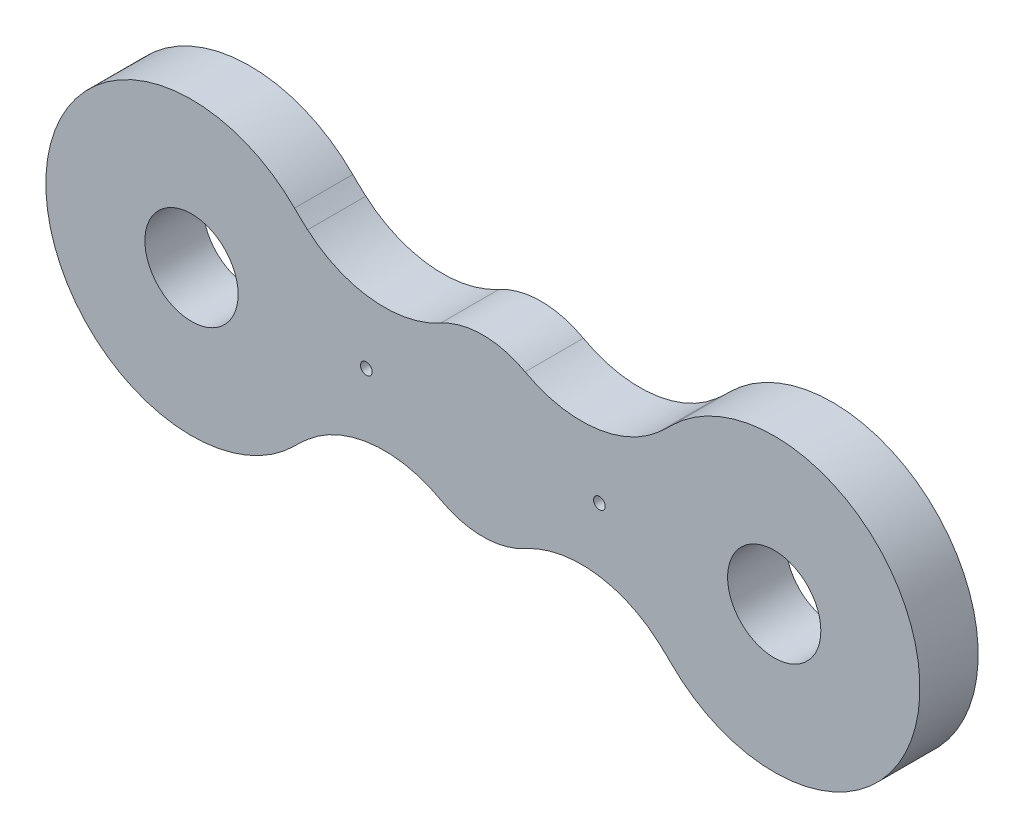
ISO-10303-21;
HEADER;
FILE_DESCRIPTION(('STEP AP214'),'2;1');
FILE_NAME('part.step','',(''),(''),'','','');
FILE_SCHEMA(('AUTOMOTIVE_DESIGN { 1 0 10303 214 1 1 1 1 }'));
ENDSEC;
DATA;
#1=APPLICATION_CONTEXT('core data for automotive mechanical design processes');
#2=APPLICATION_PROTOCOL_DEFINITION('international standard','automotive_design',2000,#1);
#3=PRODUCT_CONTEXT('',#1,'mechanical');
#4=PRODUCT('Part','Part','',(#3));
#5=PRODUCT_RELATED_PRODUCT_CATEGORY('part','',(#4));
#6=PRODUCT_DEFINITION_FORMATION('','',#4);
#7=PRODUCT_DEFINITION_CONTEXT('part definition',#1,'design');
#8=PRODUCT_DEFINITION('design','',#6,#7);
#9=PRODUCT_DEFINITION_SHAPE('','',#8);
#10=(LENGTH_UNIT() NAMED_UNIT(*) SI_UNIT(.MILLI.,.METRE.));
#11=(NAMED_UNIT(*) PLANE_ANGLE_UNIT() SI_UNIT($,.RADIAN.));
#12=(NAMED_UNIT(*) SI_UNIT($,.STERADIAN.) SOLID_ANGLE_UNIT());
#13=UNCERTAINTY_MEASURE_WITH_UNIT(LENGTH_MEASURE(1.E-05),#10,'distance_accuracy_value','');
#14=(GEOMETRIC_REPRESENTATION_CONTEXT(3) GLOBAL_UNCERTAINTY_ASSIGNED_CONTEXT((#13)) GLOBAL_UNIT_ASSIGNED_CONTEXT((#10,
#11,#12)) REPRESENTATION_CONTEXT('',''));
#15=CARTESIAN_POINT('',(0.,0.,0.));
#16=DIRECTION('',(0.,0.,1.));
#17=DIRECTION('',(1.,0.,0.));
#18=AXIS2_PLACEMENT_3D('',#15,#16,#17);
#19=CARTESIAN_POINT('',(-4.22946716685515,20.1599025766974,5.));
#20=DIRECTION('',(0.,0.,1.));
#21=DIRECTION('',(1.,0.,0.));
#22=AXIS2_PLACEMENT_3D('',#19,#20,#21);
#23=PLANE('',#22);
#24=CARTESIAN_POINT('',(-10.,0.,5.));
#25=DIRECTION('',(0.,0.,1.));
#26=DIRECTION('',(1.,0.,0.));
#27=AXIS2_PLACEMENT_3D('',#24,#25,#26);
#28=CIRCLE('',#27,0.500000000000001);
#29=CARTESIAN_POINT('',(-9.5,0.,5.));
#30=VERTEX_POINT('',#29);
#31=EDGE_CURVE('E291',#30,#30,#28,.T.);
#32=ORIENTED_EDGE('',*,*,#31,.F.);
#33=EDGE_LOOP('',(#32));
#34=FACE_BOUND('',#33,.T.);
#35=CARTESIAN_POINT('',(-25.,0.,5.));
#36=DIRECTION('',(0.,0.,1.));
#37=DIRECTION('',(1.,0.,0.));
#38=AXIS2_PLACEMENT_3D('',#35,#36,#37);
#39=CIRCLE('',#38,4.);
#40=CARTESIAN_POINT('',(-21.,0.,5.));
#41=VERTEX_POINT('',#40);
#42=EDGE_CURVE('E157',#41,#41,#39,.T.);
#43=ORIENTED_EDGE('',*,*,#42,.F.);
#44=EDGE_LOOP('',(#43));
#45=FACE_BOUND('',#44,.T.);
#46=CARTESIAN_POINT('',(0.,25.0000000000001,5.));
#47=DIRECTION('',(0.,0.,-1.));
#48=DIRECTION('',(1.,0.,0.));
#49=AXIS2_PLACEMENT_3D('',#46,#47,#48);
#50=CIRCLE('',#49,22.8553390593274);
#51=CARTESIAN_POINT('',(-15.0390286390198,7.78970827930107,5.));
#52=VERTEX_POINT('',#51);
#53=CARTESIAN_POINT('',(-16.1611652351682,8.83883476483186,5.));
#54=VERTEX_POINT('',#53);
#55=EDGE_CURVE('E176',#52,#54,#50,.T.);
#56=ORIENTED_EDGE('',*,*,#55,.T.);
#57=CARTESIAN_POINT('',(-25.,0.,5.));
#58=DIRECTION('',(0.,0.,1.));
#59=DIRECTION('',(1.,0.,0.));
#60=AXIS2_PLACEMENT_3D('',#57,#58,#59);
#61=CIRCLE('',#60,12.5);
#62=CARTESIAN_POINT('',(-16.1611652351681,-8.83883476483179,5.));
#63=VERTEX_POINT('',#62);
#64=EDGE_CURVE('E104',#54,#63,#61,.T.);
#65=ORIENTED_EDGE('',*,*,#64,.T.);
#66=CARTESIAN_POINT('',(0.,-24.9999999999997,5.));
#67=DIRECTION('',(0.,0.,-1.));
#68=DIRECTION('',(-1.,0.,0.));
#69=AXIS2_PLACEMENT_3D('',#66,#67,#68);
#70=CIRCLE('',#69,22.8553390593272);
#71=CARTESIAN_POINT('',(-15.03902863902,-7.7897082793012,5.));
#72=VERTEX_POINT('',#71);
#73=EDGE_CURVE('E203',#63,#72,#70,.T.);
#74=ORIENTED_EDGE('',*,*,#73,.T.);
#75=CARTESIAN_POINT('',(-8.45893433371032,-15.3198051533946,5.));
#76=DIRECTION('',(0.,0.,-1.));
#77=DIRECTION('',(1.,0.,0.));
#78=AXIS2_PLACEMENT_3D('',#75,#76,#77);
#79=CIRCLE('',#78,10.);
#80=CARTESIAN_POINT('',(-3.62525757159014,-6.56563078002627,5.));
#81=VERTEX_POINT('',#80);
#82=EDGE_CURVE('E222',#72,#81,#79,.T.);
#83=ORIENTED_EDGE('',*,*,#82,.T.);
#84=CARTESIAN_POINT('',(0.,0.,5.));
#85=DIRECTION('',(0.,0.,1.));
#86=DIRECTION('',(1.,0.,0.));
#87=AXIS2_PLACEMENT_3D('',#84,#85,#86);
#88=CIRCLE('',#87,7.5);
#89=CARTESIAN_POINT('',(3.62525757159014,-6.56563078002627,5.));
#90=VERTEX_POINT('',#89);
#91=EDGE_CURVE('E219',#81,#90,#88,.T.);
#92=ORIENTED_EDGE('',*,*,#91,.T.);
#93=CARTESIAN_POINT('',(8.45893433371032,-15.3198051533946,5.));
#94=DIRECTION('',(0.,0.,-1.));
#95=DIRECTION('',(-1.,0.,0.));
#96=AXIS2_PLACEMENT_3D('',#93,#94,#95);
#97=CIRCLE('',#96,10.);
#98=CARTESIAN_POINT('',(15.03902863902,-7.78970827930119,5.));
#99=VERTEX_POINT('',#98);
#100=EDGE_CURVE('E221',#90,#99,#97,.T.);
#101=ORIENTED_EDGE('',*,*,#100,.T.);
#102=CARTESIAN_POINT('',(0.,-24.9999999999997,5.));
#103=DIRECTION('',(0.,0.,-1.));
#104=DIRECTION('',(-1.,0.,0.));
#105=AXIS2_PLACEMENT_3D('',#102,#103,#104);
#106=CIRCLE('',#105,22.8553390593272);
#107=CARTESIAN_POINT('',(16.1611652351682,-8.83883476483186,5.));
#108=VERTEX_POINT('',#107);
#109=EDGE_CURVE('E224',#99,#108,#106,.T.);
#110=ORIENTED_EDGE('',*,*,#109,.T.);
#111=CARTESIAN_POINT('',(25.,0.,5.));
#112=DIRECTION('',(0.,0.,1.));
#113=DIRECTION('',(1.,0.,0.));
#114=AXIS2_PLACEMENT_3D('',#111,#112,#113);
#115=CIRCLE('',#114,12.5);
#116=CARTESIAN_POINT('',(16.1611652351681,8.83883476483179,5.));
#117=VERTEX_POINT('',#116);
#118=EDGE_CURVE('E230',#108,#117,#115,.T.);
#119=ORIENTED_EDGE('',*,*,#118,.T.);
#120=CARTESIAN_POINT('',(0.,25.0000000000001,5.));
#121=DIRECTION('',(0.,0.,-1.));
#122=DIRECTION('',(1.,0.,0.));
#123=AXIS2_PLACEMENT_3D('',#120,#121,#122);
#124=CIRCLE('',#123,22.8553390593274);
#125=CARTESIAN_POINT('',(15.0390286390198,7.78970827930105,5.));
#126=VERTEX_POINT('',#125);
#127=EDGE_CURVE('E135',#117,#126,#124,.T.);
#128=ORIENTED_EDGE('',*,*,#127,.T.);
#129=CARTESIAN_POINT('',(8.4589343337103,15.3198051533946,5.));
#130=DIRECTION('',(0.,0.,-1.));
#131=DIRECTION('',(1.,0.,0.));
#132=AXIS2_PLACEMENT_3D('',#129,#130,#131);
#133=CIRCLE('',#132,10.);
#134=CARTESIAN_POINT('',(3.62525757159012,6.56563078002627,5.));
#135=VERTEX_POINT('',#134);
#136=EDGE_CURVE('E129',#126,#135,#133,.T.);
#137=ORIENTED_EDGE('',*,*,#136,.T.);
#138=CARTESIAN_POINT('',(0.,0.,5.));
#139=DIRECTION('',(0.,0.,1.));
#140=DIRECTION('',(1.,0.,0.));
#141=AXIS2_PLACEMENT_3D('',#138,#139,#140);
#142=CIRCLE('',#141,7.49999999999999);
#143=CARTESIAN_POINT('',(-3.62525757159013,6.56563078002627,5.));
#144=VERTEX_POINT('',#143);
#145=EDGE_CURVE('E133',#135,#144,#142,.T.);
#146=ORIENTED_EDGE('',*,*,#145,.T.);
#147=CARTESIAN_POINT('',(-8.4589343337103,15.3198051533946,5.));
#148=DIRECTION('',(0.,0.,-1.));
#149=DIRECTION('',(1.,0.,0.));
#150=AXIS2_PLACEMENT_3D('',#147,#148,#149);
#151=CIRCLE('',#150,10.);
#152=EDGE_CURVE('E49',#144,#52,#151,.T.);
#153=ORIENTED_EDGE('',*,*,#152,.T.);
#154=EDGE_LOOP('',(#56,#65,#74,#83,#92,#101,#110,#119,#128,#137,#146,#153));
#155=FACE_BOUND('',#154,.T.);
#156=CARTESIAN_POINT('',(25.,0.,5.));
#157=DIRECTION('',(0.,0.,1.));
#158=DIRECTION('',(1.,0.,0.));
#159=AXIS2_PLACEMENT_3D('',#156,#157,#158);
#160=CIRCLE('',#159,4.);
#161=CARTESIAN_POINT('',(29.,0.,5.));
#162=VERTEX_POINT('',#161);
#163=EDGE_CURVE('E297',#162,#162,#160,.T.);
#164=ORIENTED_EDGE('',*,*,#163,.F.);
#165=EDGE_LOOP('',(#164));
#166=FACE_BOUND('',#165,.T.);
#167=CARTESIAN_POINT('',(10.,0.,5.));
#168=DIRECTION('',(0.,0.,1.));
#169=DIRECTION('',(1.,0.,0.));
#170=AXIS2_PLACEMENT_3D('',#167,#168,#169);
#171=CIRCLE('',#170,0.500000000000001);
#172=CARTESIAN_POINT('',(10.5,0.,5.));
#173=VERTEX_POINT('',#172);
#174=EDGE_CURVE('E282',#173,#173,#171,.T.);
#175=ORIENTED_EDGE('',*,*,#174,.F.);
#176=EDGE_LOOP('',(#175));
#177=FACE_BOUND('',#176,.T.);
#178=ADVANCED_FACE('F32',(#34,#45,#155,#166,#177),#23,.T.);
#179=CARTESIAN_POINT('',(-4.22946716685515,20.1599025766974,0.));
#180=DIRECTION('',(0.,0.,1.));
#181=DIRECTION('',(1.,0.,0.));
#182=AXIS2_PLACEMENT_3D('',#179,#180,#181);
#183=PLANE('',#182);
#184=CARTESIAN_POINT('',(-10.,0.,0.));
#185=DIRECTION('',(0.,0.,1.));
#186=DIRECTION('',(1.,0.,0.));
#187=AXIS2_PLACEMENT_3D('',#184,#185,#186);
#188=CIRCLE('',#187,0.500000000000001);
#189=CARTESIAN_POINT('',(-9.5,0.,0.));
#190=VERTEX_POINT('',#189);
#191=EDGE_CURVE('E288',#190,#190,#188,.T.);
#192=ORIENTED_EDGE('',*,*,#191,.T.);
#193=EDGE_LOOP('',(#192));
#194=FACE_BOUND('',#193,.T.);
#195=CARTESIAN_POINT('',(-25.,0.,0.));
#196=DIRECTION('',(0.,0.,1.));
#197=DIRECTION('',(1.,0.,0.));
#198=AXIS2_PLACEMENT_3D('',#195,#196,#197);
#199=CIRCLE('',#198,4.);
#200=CARTESIAN_POINT('',(-21.,0.,0.));
#201=VERTEX_POINT('',#200);
#202=EDGE_CURVE('E300',#201,#201,#199,.T.);
#203=ORIENTED_EDGE('',*,*,#202,.T.);
#204=EDGE_LOOP('',(#203));
#205=FACE_BOUND('',#204,.T.);
#206=CARTESIAN_POINT('',(0.,25.0000000000001,0.));
#207=DIRECTION('',(0.,0.,-1.));
#208=DIRECTION('',(1.,0.,0.));
#209=AXIS2_PLACEMENT_3D('',#206,#207,#208);
#210=CIRCLE('',#209,22.8553390593274);
#211=CARTESIAN_POINT('',(-15.0390286390198,7.78970827930107,0.));
#212=VERTEX_POINT('',#211);
#213=CARTESIAN_POINT('',(-16.1611652351682,8.83883476483186,0.));
#214=VERTEX_POINT('',#213);
#215=EDGE_CURVE('E153',#212,#214,#210,.T.);
#216=ORIENTED_EDGE('',*,*,#215,.F.);
#217=CARTESIAN_POINT('',(-8.4589343337103,15.3198051533946,0.));
#218=DIRECTION('',(0.,0.,-1.));
#219=DIRECTION('',(1.,0.,0.));
#220=AXIS2_PLACEMENT_3D('',#217,#218,#219);
#221=CIRCLE('',#220,10.);
#222=CARTESIAN_POINT('',(-3.62525757159013,6.56563078002627,0.));
#223=VERTEX_POINT('',#222);
#224=EDGE_CURVE('E96',#223,#212,#221,.T.);
#225=ORIENTED_EDGE('',*,*,#224,.F.);
#226=CARTESIAN_POINT('',(0.,0.,0.));
#227=DIRECTION('',(0.,0.,1.));
#228=DIRECTION('',(1.,0.,0.));
#229=AXIS2_PLACEMENT_3D('',#226,#227,#228);
#230=CIRCLE('',#229,7.49999999999999);
#231=CARTESIAN_POINT('',(3.62525757159012,6.56563078002627,0.));
#232=VERTEX_POINT('',#231);
#233=EDGE_CURVE('E90',#232,#223,#230,.T.);
#234=ORIENTED_EDGE('',*,*,#233,.F.);
#235=CARTESIAN_POINT('',(8.4589343337103,15.3198051533946,0.));
#236=DIRECTION('',(0.,0.,-1.));
#237=DIRECTION('',(1.,0.,0.));
#238=AXIS2_PLACEMENT_3D('',#235,#236,#237);
#239=CIRCLE('',#238,10.);
#240=CARTESIAN_POINT('',(15.0390286390198,7.78970827930105,0.));
#241=VERTEX_POINT('',#240);
#242=EDGE_CURVE('E143',#241,#232,#239,.T.);
#243=ORIENTED_EDGE('',*,*,#242,.F.);
#244=CARTESIAN_POINT('',(0.,25.0000000000001,0.));
#245=DIRECTION('',(0.,0.,-1.));
#246=DIRECTION('',(1.,0.,0.));
#247=AXIS2_PLACEMENT_3D('',#244,#245,#246);
#248=CIRCLE('',#247,22.8553390593274);
#249=CARTESIAN_POINT('',(16.1611652351681,8.83883476483179,0.));
#250=VERTEX_POINT('',#249);
#251=EDGE_CURVE('E171',#250,#241,#248,.T.);
#252=ORIENTED_EDGE('',*,*,#251,.F.);
#253=CARTESIAN_POINT('',(25.,0.,0.));
#254=DIRECTION('',(0.,0.,1.));
#255=DIRECTION('',(1.,0.,0.));
#256=AXIS2_PLACEMENT_3D('',#253,#254,#255);
#257=CIRCLE('',#256,12.5);
#258=CARTESIAN_POINT('',(16.1611652351682,-8.83883476483186,0.));
#259=VERTEX_POINT('',#258);
#260=EDGE_CURVE('E169',#259,#250,#257,.T.);
#261=ORIENTED_EDGE('',*,*,#260,.F.);
#262=CARTESIAN_POINT('',(0.,-24.9999999999997,0.));
#263=DIRECTION('',(0.,0.,-1.));
#264=DIRECTION('',(-1.,0.,0.));
#265=AXIS2_PLACEMENT_3D('',#262,#263,#264);
#266=CIRCLE('',#265,22.8553390593272);
#267=CARTESIAN_POINT('',(15.03902863902,-7.78970827930119,0.));
#268=VERTEX_POINT('',#267);
#269=EDGE_CURVE('E167',#268,#259,#266,.T.);
#270=ORIENTED_EDGE('',*,*,#269,.F.);
#271=CARTESIAN_POINT('',(8.45893433371032,-15.3198051533946,0.));
#272=DIRECTION('',(0.,0.,-1.));
#273=DIRECTION('',(-1.,0.,0.));
#274=AXIS2_PLACEMENT_3D('',#271,#272,#273);
#275=CIRCLE('',#274,10.);
#276=CARTESIAN_POINT('',(3.62525757159014,-6.56563078002627,0.));
#277=VERTEX_POINT('',#276);
#278=EDGE_CURVE('E165',#277,#268,#275,.T.);
#279=ORIENTED_EDGE('',*,*,#278,.F.);
#280=CARTESIAN_POINT('',(0.,0.,0.));
#281=DIRECTION('',(0.,0.,1.));
#282=DIRECTION('',(1.,0.,0.));
#283=AXIS2_PLACEMENT_3D('',#280,#281,#282);
#284=CIRCLE('',#283,7.5);
#285=CARTESIAN_POINT('',(-3.62525757159014,-6.56563078002627,0.));
#286=VERTEX_POINT('',#285);
#287=EDGE_CURVE('E163',#286,#277,#284,.T.);
#288=ORIENTED_EDGE('',*,*,#287,.F.);
#289=CARTESIAN_POINT('',(-8.45893433371032,-15.3198051533946,0.));
#290=DIRECTION('',(0.,0.,-1.));
#291=DIRECTION('',(1.,0.,0.));
#292=AXIS2_PLACEMENT_3D('',#289,#290,#291);
#293=CIRCLE('',#292,10.);
#294=CARTESIAN_POINT('',(-15.03902863902,-7.7897082793012,0.));
#295=VERTEX_POINT('',#294);
#296=EDGE_CURVE('E161',#295,#286,#293,.T.);
#297=ORIENTED_EDGE('',*,*,#296,.F.);
#298=CARTESIAN_POINT('',(0.,-24.9999999999997,0.));
#299=DIRECTION('',(0.,0.,-1.));
#300=DIRECTION('',(-1.,0.,0.));
#301=AXIS2_PLACEMENT_3D('',#298,#299,#300);
#302=CIRCLE('',#301,22.8553390593272);
#303=CARTESIAN_POINT('',(-16.1611652351681,-8.83883476483179,0.));
#304=VERTEX_POINT('',#303);
#305=EDGE_CURVE('E159',#304,#295,#302,.T.);
#306=ORIENTED_EDGE('',*,*,#305,.F.);
#307=CARTESIAN_POINT('',(-25.,0.,0.));
#308=DIRECTION('',(0.,0.,1.));
#309=DIRECTION('',(1.,0.,0.));
#310=AXIS2_PLACEMENT_3D('',#307,#308,#309);
#311=CIRCLE('',#310,12.5);
#312=EDGE_CURVE('E156',#214,#304,#311,.T.);
#313=ORIENTED_EDGE('',*,*,#312,.F.);
#314=EDGE_LOOP('',(#216,#225,#234,#243,#252,#261,#270,#279,#288,#297,#306,#313));
#315=FACE_BOUND('',#314,.T.);
#316=CARTESIAN_POINT('',(25.,0.,0.));
#317=DIRECTION('',(0.,0.,1.));
#318=DIRECTION('',(1.,0.,0.));
#319=AXIS2_PLACEMENT_3D('',#316,#317,#318);
#320=CIRCLE('',#319,4.);
#321=CARTESIAN_POINT('',(29.,0.,0.));
#322=VERTEX_POINT('',#321);
#323=EDGE_CURVE('E294',#322,#322,#320,.T.);
#324=ORIENTED_EDGE('',*,*,#323,.T.);
#325=EDGE_LOOP('',(#324));
#326=FACE_BOUND('',#325,.T.);
#327=CARTESIAN_POINT('',(10.,0.,0.));
#328=DIRECTION('',(0.,0.,1.));
#329=DIRECTION('',(1.,0.,0.));
#330=AXIS2_PLACEMENT_3D('',#327,#328,#329);
#331=CIRCLE('',#330,0.500000000000001);
#332=CARTESIAN_POINT('',(10.5,0.,0.));
#333=VERTEX_POINT('',#332);
#334=EDGE_CURVE('E285',#333,#333,#331,.T.);
#335=ORIENTED_EDGE('',*,*,#334,.T.);
#336=EDGE_LOOP('',(#335));
#337=FACE_BOUND('',#336,.T.);
#338=ADVANCED_FACE('F207',(#194,#205,#315,#326,#337),#183,.F.);
#339=CARTESIAN_POINT('',(0.,25.0000000000001,5.));
#340=DIRECTION('',(0.,0.,-1.));
#341=DIRECTION('',(-1.,0.,0.));
#342=AXIS2_PLACEMENT_3D('',#339,#340,#341);
#343=CYLINDRICAL_SURFACE('',#342,22.8553390593274);
#344=ORIENTED_EDGE('',*,*,#215,.T.);
#345=DIRECTION('',(0.,0.,-1.));
#346=VECTOR('',#345,1.);
#347=CARTESIAN_POINT('',(-16.1611652351682,8.83883476483186,5.));
#348=LINE('',#347,#346);
#349=EDGE_CURVE('E11',#54,#214,#348,.T.);
#350=ORIENTED_EDGE('',*,*,#349,.F.);
#351=ORIENTED_EDGE('',*,*,#55,.F.);
#352=DIRECTION('',(0.,0.,-1.));
#353=VECTOR('',#352,1.);
#354=CARTESIAN_POINT('',(-15.0390286390198,7.78970827930107,5.));
#355=LINE('',#354,#353);
#356=EDGE_CURVE('E149',#52,#212,#355,.T.);
#357=ORIENTED_EDGE('',*,*,#356,.T.);
#358=EDGE_LOOP('',(#344,#350,#351,#357));
#359=FACE_BOUND('',#358,.T.);
#360=ADVANCED_FACE('F34',(#359),#343,.F.);
#361=CARTESIAN_POINT('',(-25.,0.,5.));
#362=DIRECTION('',(0.,0.,-1.));
#363=DIRECTION('',(-1.,0.,0.));
#364=AXIS2_PLACEMENT_3D('',#361,#362,#363);
#365=CYLINDRICAL_SURFACE('',#364,12.5);
#366=ORIENTED_EDGE('',*,*,#312,.T.);
#367=DIRECTION('',(0.,0.,-1.));
#368=VECTOR('',#367,1.);
#369=CARTESIAN_POINT('',(-16.1611652351681,-8.83883476483179,5.));
#370=LINE('',#369,#368);
#371=EDGE_CURVE('E41',#63,#304,#370,.T.);
#372=ORIENTED_EDGE('',*,*,#371,.F.);
#373=ORIENTED_EDGE('',*,*,#64,.F.);
#374=ORIENTED_EDGE('',*,*,#349,.T.);
#375=EDGE_LOOP('',(#366,#372,#373,#374));
#376=FACE_BOUND('',#375,.T.);
#377=ADVANCED_FACE('F409',(#376),#365,.T.);
#378=CARTESIAN_POINT('',(0.,-24.9999999999997,5.));
#379=DIRECTION('',(0.,0.,-1.));
#380=DIRECTION('',(-1.,0.,0.));
#381=AXIS2_PLACEMENT_3D('',#378,#379,#380);
#382=CYLINDRICAL_SURFACE('',#381,22.8553390593272);
#383=ORIENTED_EDGE('',*,*,#305,.T.);
#384=DIRECTION('',(0.,0.,-1.));
#385=VECTOR('',#384,1.);
#386=CARTESIAN_POINT('',(-15.03902863902,-7.7897082793012,5.));
#387=LINE('',#386,#385);
#388=EDGE_CURVE('E195',#72,#295,#387,.T.);
#389=ORIENTED_EDGE('',*,*,#388,.F.);
#390=ORIENTED_EDGE('',*,*,#73,.F.);
#391=ORIENTED_EDGE('',*,*,#371,.T.);
#392=EDGE_LOOP('',(#383,#389,#390,#391));
#393=FACE_BOUND('',#392,.T.);
#394=ADVANCED_FACE('F201',(#393),#382,.F.);
#395=CARTESIAN_POINT('',(-8.45893433371032,-15.3198051533946,5.));
#396=DIRECTION('',(0.,0.,-1.));
#397=DIRECTION('',(-1.,0.,0.));
#398=AXIS2_PLACEMENT_3D('',#395,#396,#397);
#399=CYLINDRICAL_SURFACE('',#398,10.);
#400=ORIENTED_EDGE('',*,*,#296,.T.);
#401=DIRECTION('',(0.,0.,-1.));
#402=VECTOR('',#401,1.);
#403=CARTESIAN_POINT('',(-3.62525757159014,-6.56563078002627,5.));
#404=LINE('',#403,#402);
#405=EDGE_CURVE('E192',#81,#286,#404,.T.);
#406=ORIENTED_EDGE('',*,*,#405,.F.);
#407=ORIENTED_EDGE('',*,*,#82,.F.);
#408=ORIENTED_EDGE('',*,*,#388,.T.);
#409=EDGE_LOOP('',(#400,#406,#407,#408));
#410=FACE_BOUND('',#409,.T.);
#411=ADVANCED_FACE('F213',(#410),#399,.F.);
#412=CARTESIAN_POINT('',(0.,0.,5.));
#413=DIRECTION('',(0.,0.,-1.));
#414=DIRECTION('',(-1.,0.,0.));
#415=AXIS2_PLACEMENT_3D('',#412,#413,#414);
#416=CYLINDRICAL_SURFACE('',#415,7.5);
#417=ORIENTED_EDGE('',*,*,#287,.T.);
#418=DIRECTION('',(0.,0.,-1.));
#419=VECTOR('',#418,1.);
#420=CARTESIAN_POINT('',(3.62525757159014,-6.56563078002627,5.));
#421=LINE('',#420,#419);
#422=EDGE_CURVE('E189',#90,#277,#421,.T.);
#423=ORIENTED_EDGE('',*,*,#422,.F.);
#424=ORIENTED_EDGE('',*,*,#91,.F.);
#425=ORIENTED_EDGE('',*,*,#405,.T.);
#426=EDGE_LOOP('',(#417,#423,#424,#425));
#427=FACE_BOUND('',#426,.T.);
#428=ADVANCED_FACE('F217',(#427),#416,.T.);
#429=CARTESIAN_POINT('',(8.45893433371032,-15.3198051533946,5.));
#430=DIRECTION('',(0.,0.,-1.));
#431=DIRECTION('',(-1.,0.,0.));
#432=AXIS2_PLACEMENT_3D('',#429,#430,#431);
#433=CYLINDRICAL_SURFACE('',#432,10.);
#434=ORIENTED_EDGE('',*,*,#278,.T.);
#435=DIRECTION('',(0.,0.,-1.));
#436=VECTOR('',#435,1.);
#437=CARTESIAN_POINT('',(15.03902863902,-7.78970827930119,5.));
#438=LINE('',#437,#436);
#439=EDGE_CURVE('E186',#99,#268,#438,.T.);
#440=ORIENTED_EDGE('',*,*,#439,.F.);
#441=ORIENTED_EDGE('',*,*,#100,.F.);
#442=ORIENTED_EDGE('',*,*,#422,.T.);
#443=EDGE_LOOP('',(#434,#440,#441,#442));
#444=FACE_BOUND('',#443,.T.);
#445=ADVANCED_FACE('F374',(#444),#433,.F.);
#446=CARTESIAN_POINT('',(0.,-24.9999999999997,5.));
#447=DIRECTION('',(0.,0.,-1.));
#448=DIRECTION('',(-1.,0.,0.));
#449=AXIS2_PLACEMENT_3D('',#446,#447,#448);
#450=CYLINDRICAL_SURFACE('',#449,22.8553390593272);
#451=ORIENTED_EDGE('',*,*,#269,.T.);
#452=DIRECTION('',(0.,0.,-1.));
#453=VECTOR('',#452,1.);
#454=CARTESIAN_POINT('',(16.1611652351682,-8.83883476483186,5.));
#455=LINE('',#454,#453);
#456=EDGE_CURVE('E183',#108,#259,#455,.T.);
#457=ORIENTED_EDGE('',*,*,#456,.F.);
#458=ORIENTED_EDGE('',*,*,#109,.F.);
#459=ORIENTED_EDGE('',*,*,#439,.T.);
#460=EDGE_LOOP('',(#451,#457,#458,#459));
#461=FACE_BOUND('',#460,.T.);
#462=ADVANCED_FACE('F365',(#461),#450,.F.);
#463=CARTESIAN_POINT('',(25.,0.,5.));
#464=DIRECTION('',(0.,0.,-1.));
#465=DIRECTION('',(-1.,0.,0.));
#466=AXIS2_PLACEMENT_3D('',#463,#464,#465);
#467=CYLINDRICAL_SURFACE('',#466,12.5);
#468=ORIENTED_EDGE('',*,*,#260,.T.);
#469=DIRECTION('',(0.,0.,-1.));
#470=VECTOR('',#469,1.);
#471=CARTESIAN_POINT('',(16.1611652351681,8.83883476483179,5.));
#472=LINE('',#471,#470);
#473=EDGE_CURVE('E180',#117,#250,#472,.T.);
#474=ORIENTED_EDGE('',*,*,#473,.F.);
#475=ORIENTED_EDGE('',*,*,#118,.F.);
#476=ORIENTED_EDGE('',*,*,#456,.T.);
#477=EDGE_LOOP('',(#468,#474,#475,#476));
#478=FACE_BOUND('',#477,.T.);
#479=ADVANCED_FACE('F236',(#478),#467,.T.);
#480=CARTESIAN_POINT('',(0.,25.0000000000001,5.));
#481=DIRECTION('',(0.,0.,-1.));
#482=DIRECTION('',(-1.,0.,0.));
#483=AXIS2_PLACEMENT_3D('',#480,#481,#482);
#484=CYLINDRICAL_SURFACE('',#483,22.8553390593274);
#485=ORIENTED_EDGE('',*,*,#251,.T.);
#486=DIRECTION('',(0.,0.,-1.));
#487=VECTOR('',#486,1.);
#488=CARTESIAN_POINT('',(15.0390286390198,7.78970827930105,5.));
#489=LINE('',#488,#487);
#490=EDGE_CURVE('E144',#126,#241,#489,.T.);
#491=ORIENTED_EDGE('',*,*,#490,.F.);
#492=ORIENTED_EDGE('',*,*,#127,.F.);
#493=ORIENTED_EDGE('',*,*,#473,.T.);
#494=EDGE_LOOP('',(#485,#491,#492,#493));
#495=FACE_BOUND('',#494,.T.);
#496=ADVANCED_FACE('F240',(#495),#484,.F.);
#497=CARTESIAN_POINT('',(8.4589343337103,15.3198051533946,5.));
#498=DIRECTION('',(0.,0.,-1.));
#499=DIRECTION('',(-1.,0.,0.));
#500=AXIS2_PLACEMENT_3D('',#497,#498,#499);
#501=CYLINDRICAL_SURFACE('',#500,10.);
#502=ORIENTED_EDGE('',*,*,#242,.T.);
#503=DIRECTION('',(0.,0.,-1.));
#504=VECTOR('',#503,1.);
#505=CARTESIAN_POINT('',(3.62525757159012,6.56563078002627,5.));
#506=LINE('',#505,#504);
#507=EDGE_CURVE('E140',#135,#232,#506,.T.);
#508=ORIENTED_EDGE('',*,*,#507,.F.);
#509=ORIENTED_EDGE('',*,*,#136,.F.);
#510=ORIENTED_EDGE('',*,*,#490,.T.);
#511=EDGE_LOOP('',(#502,#508,#509,#510));
#512=FACE_BOUND('',#511,.T.);
#513=ADVANCED_FACE('F141',(#512),#501,.F.);
#514=CARTESIAN_POINT('',(0.,0.,5.));
#515=DIRECTION('',(0.,0.,-1.));
#516=DIRECTION('',(-1.,0.,0.));
#517=AXIS2_PLACEMENT_3D('',#514,#515,#516);
#518=CYLINDRICAL_SURFACE('',#517,7.49999999999999);
#519=ORIENTED_EDGE('',*,*,#233,.T.);
#520=DIRECTION('',(0.,0.,-1.));
#521=VECTOR('',#520,1.);
#522=CARTESIAN_POINT('',(-3.62525757159013,6.56563078002627,5.));
#523=LINE('',#522,#521);
#524=EDGE_CURVE('E145',#144,#223,#523,.T.);
#525=ORIENTED_EDGE('',*,*,#524,.F.);
#526=ORIENTED_EDGE('',*,*,#145,.F.);
#527=ORIENTED_EDGE('',*,*,#507,.T.);
#528=EDGE_LOOP('',(#519,#525,#526,#527));
#529=FACE_BOUND('',#528,.T.);
#530=ADVANCED_FACE('F147',(#529),#518,.T.);
#531=CARTESIAN_POINT('',(-8.4589343337103,15.3198051533946,5.));
#532=DIRECTION('',(0.,0.,-1.));
#533=DIRECTION('',(-1.,0.,0.));
#534=AXIS2_PLACEMENT_3D('',#531,#532,#533);
#535=CYLINDRICAL_SURFACE('',#534,10.);
#536=ORIENTED_EDGE('',*,*,#224,.T.);
#537=ORIENTED_EDGE('',*,*,#356,.F.);
#538=ORIENTED_EDGE('',*,*,#152,.F.);
#539=ORIENTED_EDGE('',*,*,#524,.T.);
#540=EDGE_LOOP('',(#536,#537,#538,#539));
#541=FACE_BOUND('',#540,.T.);
#542=ADVANCED_FACE('F244',(#541),#535,.F.);
#543=CARTESIAN_POINT('',(-25.,0.,5.));
#544=DIRECTION('',(0.,0.,-1.));
#545=DIRECTION('',(-1.,0.,0.));
#546=AXIS2_PLACEMENT_3D('',#543,#544,#545);
#547=CYLINDRICAL_SURFACE('',#546,4.);
#548=ORIENTED_EDGE('',*,*,#42,.T.);
#549=EDGE_LOOP('',(#548));
#550=FACE_BOUND('',#549,.T.);
#551=ORIENTED_EDGE('',*,*,#202,.F.);
#552=EDGE_LOOP('',(#551));
#553=FACE_BOUND('',#552,.T.);
#554=ADVANCED_FACE('F246',(#550,#553),#547,.F.);
#555=CARTESIAN_POINT('',(25.,0.,5.));
#556=DIRECTION('',(0.,0.,-1.));
#557=DIRECTION('',(-1.,0.,0.));
#558=AXIS2_PLACEMENT_3D('',#555,#556,#557);
#559=CYLINDRICAL_SURFACE('',#558,4.);
#560=ORIENTED_EDGE('',*,*,#163,.T.);
#561=EDGE_LOOP('',(#560));
#562=FACE_BOUND('',#561,.T.);
#563=ORIENTED_EDGE('',*,*,#323,.F.);
#564=EDGE_LOOP('',(#563));
#565=FACE_BOUND('',#564,.T.);
#566=ADVANCED_FACE('F252',(#562,#565),#559,.F.);
#567=CARTESIAN_POINT('',(-10.,0.,5.));
#568=DIRECTION('',(0.,0.,-1.));
#569=DIRECTION('',(-1.,0.,0.));
#570=AXIS2_PLACEMENT_3D('',#567,#568,#569);
#571=CYLINDRICAL_SURFACE('',#570,0.500000000000001);
#572=ORIENTED_EDGE('',*,*,#31,.T.);
#573=EDGE_LOOP('',(#572));
#574=FACE_BOUND('',#573,.T.);
#575=ORIENTED_EDGE('',*,*,#191,.F.);
#576=EDGE_LOOP('',(#575));
#577=FACE_BOUND('',#576,.T.);
#578=ADVANCED_FACE('F269',(#574,#577),#571,.F.);
#579=CARTESIAN_POINT('',(10.,0.,5.));
#580=DIRECTION('',(0.,0.,-1.));
#581=DIRECTION('',(-1.,0.,0.));
#582=AXIS2_PLACEMENT_3D('',#579,#580,#581);
#583=CYLINDRICAL_SURFACE('',#582,0.500000000000001);
#584=ORIENTED_EDGE('',*,*,#174,.T.);
#585=EDGE_LOOP('',(#584));
#586=FACE_BOUND('',#585,.T.);
#587=ORIENTED_EDGE('',*,*,#334,.F.);
#588=EDGE_LOOP('',(#587));
#589=FACE_BOUND('',#588,.T.);
#590=ADVANCED_FACE('F273',(#586,#589),#583,.F.);
#591=CLOSED_SHELL('',(#178,#338,#360,#377,#394,#411,#428,#445,#462,#479,#496,#513,#530,#542,
#554,#566,#578,#590));
#592=MANIFOLD_SOLID_BREP('B2',#591);
#593=ADVANCED_BREP_SHAPE_REPRESENTATION('',(#18,#592),#14);
#594=SHAPE_DEFINITION_REPRESENTATION(#9,#593);
ENDSEC;
END-ISO-10303-21;
